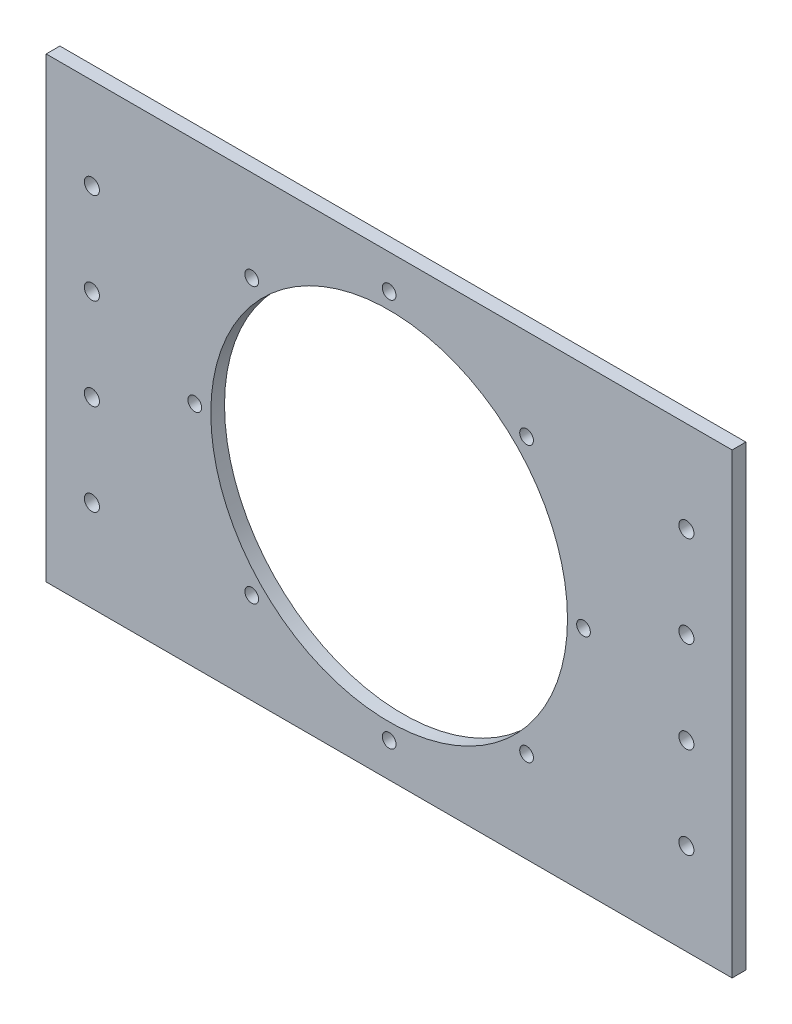
ISO-10303-21;
HEADER;
FILE_DESCRIPTION(('STEP AP214'),'2;1');
FILE_NAME('part.step','',(''),(''),'','','');
FILE_SCHEMA(('AUTOMOTIVE_DESIGN { 1 0 10303 214 1 1 1 1 }'));
ENDSEC;
DATA;
#1=APPLICATION_CONTEXT('core data for automotive mechanical design processes');
#2=APPLICATION_PROTOCOL_DEFINITION('international standard','automotive_design',2000,#1);
#3=PRODUCT_CONTEXT('',#1,'mechanical');
#4=PRODUCT('Part','Part','',(#3));
#5=PRODUCT_RELATED_PRODUCT_CATEGORY('part','',(#4));
#6=PRODUCT_DEFINITION_FORMATION('','',#4);
#7=PRODUCT_DEFINITION_CONTEXT('part definition',#1,'design');
#8=PRODUCT_DEFINITION('design','',#6,#7);
#9=PRODUCT_DEFINITION_SHAPE('','',#8);
#10=(LENGTH_UNIT() NAMED_UNIT(*) SI_UNIT(.MILLI.,.METRE.));
#11=(NAMED_UNIT(*) PLANE_ANGLE_UNIT() SI_UNIT($,.RADIAN.));
#12=(NAMED_UNIT(*) SI_UNIT($,.STERADIAN.) SOLID_ANGLE_UNIT());
#13=UNCERTAINTY_MEASURE_WITH_UNIT(LENGTH_MEASURE(1.E-05),#10,'distance_accuracy_value','');
#14=(GEOMETRIC_REPRESENTATION_CONTEXT(3) GLOBAL_UNCERTAINTY_ASSIGNED_CONTEXT((#13)) GLOBAL_UNIT_ASSIGNED_CONTEXT((#10,
#11,#12)) REPRESENTATION_CONTEXT('',''));
#15=CARTESIAN_POINT('',(0.,0.,0.));
#16=DIRECTION('',(0.,0.,1.));
#17=DIRECTION('',(1.,0.,0.));
#18=AXIS2_PLACEMENT_3D('',#15,#16,#17);
#19=CARTESIAN_POINT('',(0.,0.,3.));
#20=DIRECTION('',(0.,0.,1.));
#21=DIRECTION('',(1.,0.,0.));
#22=AXIS2_PLACEMENT_3D('',#19,#20,#21);
#23=PLANE('',#22);
#24=CARTESIAN_POINT('',(65.0000000000001,9.99999999999936,3.));
#25=DIRECTION('',(0.,0.,1.));
#26=DIRECTION('',(-1.,0.,0.));
#27=AXIS2_PLACEMENT_3D('',#24,#25,#26);
#28=CIRCLE('',#27,1.65000000000001);
#29=CARTESIAN_POINT('',(63.3500000000001,9.99999999999936,3.));
#30=VERTEX_POINT('',#29);
#31=EDGE_CURVE('E207',#30,#30,#28,.T.);
#32=ORIENTED_EDGE('',*,*,#31,.F.);
#33=EDGE_LOOP('',(#32));
#34=FACE_BOUND('',#33,.T.);
#35=CARTESIAN_POINT('',(64.9999999999997,-30.0000000000006,3.));
#36=DIRECTION('',(0.,0.,1.));
#37=DIRECTION('',(-1.,0.,0.));
#38=AXIS2_PLACEMENT_3D('',#35,#36,#37);
#39=CIRCLE('',#38,1.65000000000001);
#40=CARTESIAN_POINT('',(63.3499999999997,-30.0000000000006,3.));
#41=VERTEX_POINT('',#40);
#42=EDGE_CURVE('E195',#41,#41,#39,.T.);
#43=ORIENTED_EDGE('',*,*,#42,.F.);
#44=EDGE_LOOP('',(#43));
#45=FACE_BOUND('',#44,.T.);
#46=CARTESIAN_POINT('',(-65.,-10.,3.));
#47=DIRECTION('',(0.,0.,1.));
#48=DIRECTION('',(1.,0.,0.));
#49=AXIS2_PLACEMENT_3D('',#46,#47,#48);
#50=CIRCLE('',#49,1.65);
#51=CARTESIAN_POINT('',(-63.35,-10.,3.));
#52=VERTEX_POINT('',#51);
#53=EDGE_CURVE('E183',#52,#52,#50,.T.);
#54=ORIENTED_EDGE('',*,*,#53,.F.);
#55=EDGE_LOOP('',(#54));
#56=FACE_BOUND('',#55,.T.);
#57=CARTESIAN_POINT('',(-65.,30.,3.));
#58=DIRECTION('',(0.,0.,1.));
#59=DIRECTION('',(1.,0.,0.));
#60=AXIS2_PLACEMENT_3D('',#57,#58,#59);
#61=CIRCLE('',#60,1.65);
#62=CARTESIAN_POINT('',(-63.35,30.,3.));
#63=VERTEX_POINT('',#62);
#64=EDGE_CURVE('E171',#63,#63,#61,.T.);
#65=ORIENTED_EDGE('',*,*,#64,.F.);
#66=EDGE_LOOP('',(#65));
#67=FACE_BOUND('',#66,.T.);
#68=CARTESIAN_POINT('',(4.451638707025E-13,42.5,3.));
#69=DIRECTION('',(0.,0.,1.));
#70=DIRECTION('',(1.,0.,0.));
#71=AXIS2_PLACEMENT_3D('',#68,#69,#70);
#72=CIRCLE('',#71,1.50000000000001);
#73=CARTESIAN_POINT('',(1.50000000000045,42.5,3.));
#74=VERTEX_POINT('',#73);
#75=EDGE_CURVE('E159',#74,#74,#72,.T.);
#76=ORIENTED_EDGE('',*,*,#75,.F.);
#77=EDGE_LOOP('',(#76));
#78=FACE_BOUND('',#77,.T.);
#79=CARTESIAN_POINT('',(-42.5,2.96775913801666E-13,3.));
#80=DIRECTION('',(0.,0.,1.));
#81=DIRECTION('',(1.,0.,0.));
#82=AXIS2_PLACEMENT_3D('',#79,#80,#81);
#83=CIRCLE('',#82,1.5);
#84=CARTESIAN_POINT('',(-41.,2.96775913801666E-13,3.));
#85=VERTEX_POINT('',#84);
#86=EDGE_CURVE('E147',#85,#85,#83,.T.);
#87=ORIENTED_EDGE('',*,*,#86,.F.);
#88=EDGE_LOOP('',(#87));
#89=FACE_BOUND('',#88,.T.);
#90=CARTESIAN_POINT('',(-1.48387956900833E-13,-42.5,3.));
#91=DIRECTION('',(0.,0.,1.));
#92=DIRECTION('',(1.,0.,0.));
#93=AXIS2_PLACEMENT_3D('',#90,#91,#92);
#94=CIRCLE('',#93,1.5);
#95=CARTESIAN_POINT('',(1.49999999999985,-42.5,3.));
#96=VERTEX_POINT('',#95);
#97=EDGE_CURVE('E135',#96,#96,#94,.T.);
#98=ORIENTED_EDGE('',*,*,#97,.F.);
#99=EDGE_LOOP('',(#98));
#100=FACE_BOUND('',#99,.T.);
#101=CARTESIAN_POINT('',(42.5,0.,3.));
#102=DIRECTION('',(0.,0.,1.));
#103=DIRECTION('',(1.,0.,0.));
#104=AXIS2_PLACEMENT_3D('',#101,#102,#103);
#105=CIRCLE('',#104,1.5);
#106=CARTESIAN_POINT('',(44.,0.,3.));
#107=VERTEX_POINT('',#106);
#108=EDGE_CURVE('E123',#107,#107,#105,.T.);
#109=ORIENTED_EDGE('',*,*,#108,.F.);
#110=EDGE_LOOP('',(#109));
#111=FACE_BOUND('',#110,.T.);
#112=DIRECTION('',(0.,1.,0.));
#113=VECTOR('',#112,1.);
#114=CARTESIAN_POINT('',(75.,50.,3.));
#115=LINE('',#114,#113);
#116=CARTESIAN_POINT('',(75.,-50.,3.));
#117=VERTEX_POINT('',#116);
#118=CARTESIAN_POINT('',(75.,50.,3.));
#119=VERTEX_POINT('',#118);
#120=EDGE_CURVE('E93',#117,#119,#115,.T.);
#121=ORIENTED_EDGE('',*,*,#120,.T.);
#122=DIRECTION('',(-1.,0.,0.));
#123=VECTOR('',#122,1.);
#124=CARTESIAN_POINT('',(-75.,50.,3.));
#125=LINE('',#124,#123);
#126=CARTESIAN_POINT('',(-75.,50.,3.));
#127=VERTEX_POINT('',#126);
#128=EDGE_CURVE('E88',#119,#127,#125,.T.);
#129=ORIENTED_EDGE('',*,*,#128,.T.);
#130=DIRECTION('',(0.,-1.,0.));
#131=VECTOR('',#130,1.);
#132=CARTESIAN_POINT('',(-75.,50.,3.));
#133=LINE('',#132,#131);
#134=CARTESIAN_POINT('',(-75.,-50.,3.));
#135=VERTEX_POINT('',#134);
#136=EDGE_CURVE('E91',#127,#135,#133,.T.);
#137=ORIENTED_EDGE('',*,*,#136,.T.);
#138=DIRECTION('',(1.,0.,0.));
#139=VECTOR('',#138,1.);
#140=CARTESIAN_POINT('',(-75.,-50.,3.));
#141=LINE('',#140,#139);
#142=EDGE_CURVE('E58',#135,#117,#141,.T.);
#143=ORIENTED_EDGE('',*,*,#142,.T.);
#144=EDGE_LOOP('',(#121,#129,#137,#143));
#145=FACE_BOUND('',#144,.T.);
#146=CARTESIAN_POINT('',(0.,0.,3.));
#147=DIRECTION('',(0.,0.,1.));
#148=DIRECTION('',(1.,0.,0.));
#149=AXIS2_PLACEMENT_3D('',#146,#147,#148);
#150=CIRCLE('',#149,39.);
#151=CARTESIAN_POINT('',(39.,0.,3.));
#152=VERTEX_POINT('',#151);
#153=EDGE_CURVE('E108',#152,#152,#150,.T.);
#154=ORIENTED_EDGE('',*,*,#153,.F.);
#155=EDGE_LOOP('',(#154));
#156=FACE_BOUND('',#155,.T.);
#157=CARTESIAN_POINT('',(30.0520382004282,-30.0520382004283,3.));
#158=DIRECTION('',(0.,0.,1.));
#159=DIRECTION('',(1.,0.,0.));
#160=AXIS2_PLACEMENT_3D('',#157,#158,#159);
#161=CIRCLE('',#160,1.5);
#162=CARTESIAN_POINT('',(31.5520382004282,-30.0520382004283,3.));
#163=VERTEX_POINT('',#162);
#164=EDGE_CURVE('E129',#163,#163,#161,.T.);
#165=ORIENTED_EDGE('',*,*,#164,.F.);
#166=EDGE_LOOP('',(#165));
#167=FACE_BOUND('',#166,.T.);
#168=CARTESIAN_POINT('',(-30.0520382004284,-30.0520382004281,3.));
#169=DIRECTION('',(0.,0.,1.));
#170=DIRECTION('',(1.,0.,0.));
#171=AXIS2_PLACEMENT_3D('',#168,#169,#170);
#172=CIRCLE('',#171,1.5);
#173=CARTESIAN_POINT('',(-28.5520382004284,-30.0520382004281,3.));
#174=VERTEX_POINT('',#173);
#175=EDGE_CURVE('E141',#174,#174,#172,.T.);
#176=ORIENTED_EDGE('',*,*,#175,.F.);
#177=EDGE_LOOP('',(#176));
#178=FACE_BOUND('',#177,.T.);
#179=CARTESIAN_POINT('',(-30.052038200428,30.0520382004285,3.));
#180=DIRECTION('',(0.,0.,1.));
#181=DIRECTION('',(1.,0.,0.));
#182=AXIS2_PLACEMENT_3D('',#179,#180,#181);
#183=CIRCLE('',#182,1.50000000000001);
#184=CARTESIAN_POINT('',(-28.552038200428,30.0520382004285,3.));
#185=VERTEX_POINT('',#184);
#186=EDGE_CURVE('E153',#185,#185,#183,.T.);
#187=ORIENTED_EDGE('',*,*,#186,.F.);
#188=EDGE_LOOP('',(#187));
#189=FACE_BOUND('',#188,.T.);
#190=CARTESIAN_POINT('',(30.0520382004286,30.0520382004279,3.));
#191=DIRECTION('',(0.,0.,1.));
#192=DIRECTION('',(1.,0.,0.));
#193=AXIS2_PLACEMENT_3D('',#190,#191,#192);
#194=CIRCLE('',#193,1.50000000000001);
#195=CARTESIAN_POINT('',(31.5520382004287,30.0520382004279,3.));
#196=VERTEX_POINT('',#195);
#197=EDGE_CURVE('E165',#196,#196,#194,.T.);
#198=ORIENTED_EDGE('',*,*,#197,.F.);
#199=EDGE_LOOP('',(#198));
#200=FACE_BOUND('',#199,.T.);
#201=CARTESIAN_POINT('',(-65.,10.,3.));
#202=DIRECTION('',(0.,0.,1.));
#203=DIRECTION('',(1.,0.,0.));
#204=AXIS2_PLACEMENT_3D('',#201,#202,#203);
#205=CIRCLE('',#204,1.65);
#206=CARTESIAN_POINT('',(-63.35,10.,3.));
#207=VERTEX_POINT('',#206);
#208=EDGE_CURVE('E177',#207,#207,#205,.T.);
#209=ORIENTED_EDGE('',*,*,#208,.F.);
#210=EDGE_LOOP('',(#209));
#211=FACE_BOUND('',#210,.T.);
#212=CARTESIAN_POINT('',(-65.,-30.,3.));
#213=DIRECTION('',(0.,0.,1.));
#214=DIRECTION('',(1.,0.,0.));
#215=AXIS2_PLACEMENT_3D('',#212,#213,#214);
#216=CIRCLE('',#215,1.65);
#217=CARTESIAN_POINT('',(-63.35,-30.,3.));
#218=VERTEX_POINT('',#217);
#219=EDGE_CURVE('E189',#218,#218,#216,.T.);
#220=ORIENTED_EDGE('',*,*,#219,.F.);
#221=EDGE_LOOP('',(#220));
#222=FACE_BOUND('',#221,.T.);
#223=CARTESIAN_POINT('',(64.9999999999999,-10.0000000000006,3.));
#224=DIRECTION('',(0.,0.,1.));
#225=DIRECTION('',(-1.,0.,0.));
#226=AXIS2_PLACEMENT_3D('',#223,#224,#225);
#227=CIRCLE('',#226,1.64999999999998);
#228=CARTESIAN_POINT('',(63.3499999999999,-10.0000000000006,3.));
#229=VERTEX_POINT('',#228);
#230=EDGE_CURVE('E201',#229,#229,#227,.T.);
#231=ORIENTED_EDGE('',*,*,#230,.F.);
#232=EDGE_LOOP('',(#231));
#233=FACE_BOUND('',#232,.T.);
#234=CARTESIAN_POINT('',(65.0000000000003,29.9999999999994,3.));
#235=DIRECTION('',(0.,0.,1.));
#236=DIRECTION('',(-1.,0.,0.));
#237=AXIS2_PLACEMENT_3D('',#234,#235,#236);
#238=CIRCLE('',#237,1.65000000000001);
#239=CARTESIAN_POINT('',(63.3500000000003,29.9999999999994,3.));
#240=VERTEX_POINT('',#239);
#241=EDGE_CURVE('E213',#240,#240,#238,.T.);
#242=ORIENTED_EDGE('',*,*,#241,.F.);
#243=EDGE_LOOP('',(#242));
#244=FACE_BOUND('',#243,.T.);
#245=ADVANCED_FACE('F41',(#34,#45,#56,#67,#78,#89,#100,#111,#145,#156,#167,#178,#189,#200,#211,
#222,#233,#244),#23,.T.);
#246=CARTESIAN_POINT('',(0.,0.,0.));
#247=DIRECTION('',(0.,0.,1.));
#248=DIRECTION('',(1.,0.,0.));
#249=AXIS2_PLACEMENT_3D('',#246,#247,#248);
#250=PLANE('',#249);
#251=DIRECTION('',(0.,1.,0.));
#252=VECTOR('',#251,1.);
#253=CARTESIAN_POINT('',(75.,50.,0.));
#254=LINE('',#253,#252);
#255=CARTESIAN_POINT('',(75.,-50.,0.));
#256=VERTEX_POINT('',#255);
#257=CARTESIAN_POINT('',(75.,50.,0.));
#258=VERTEX_POINT('',#257);
#259=EDGE_CURVE('E105',#256,#258,#254,.T.);
#260=ORIENTED_EDGE('',*,*,#259,.F.);
#261=DIRECTION('',(1.,0.,0.));
#262=VECTOR('',#261,1.);
#263=CARTESIAN_POINT('',(-75.,-50.,0.));
#264=LINE('',#263,#262);
#265=CARTESIAN_POINT('',(-75.,-50.,0.));
#266=VERTEX_POINT('',#265);
#267=EDGE_CURVE('E81',#266,#256,#264,.T.);
#268=ORIENTED_EDGE('',*,*,#267,.F.);
#269=DIRECTION('',(0.,-1.,0.));
#270=VECTOR('',#269,1.);
#271=CARTESIAN_POINT('',(-75.,50.,0.));
#272=LINE('',#271,#270);
#273=CARTESIAN_POINT('',(-75.,50.,0.));
#274=VERTEX_POINT('',#273);
#275=EDGE_CURVE('E75',#274,#266,#272,.T.);
#276=ORIENTED_EDGE('',*,*,#275,.F.);
#277=DIRECTION('',(-1.,0.,0.));
#278=VECTOR('',#277,1.);
#279=CARTESIAN_POINT('',(-75.,50.,0.));
#280=LINE('',#279,#278);
#281=EDGE_CURVE('E97',#258,#274,#280,.T.);
#282=ORIENTED_EDGE('',*,*,#281,.F.);
#283=EDGE_LOOP('',(#260,#268,#276,#282));
#284=FACE_BOUND('',#283,.T.);
#285=CARTESIAN_POINT('',(0.,0.,0.));
#286=DIRECTION('',(0.,0.,1.));
#287=DIRECTION('',(1.,0.,0.));
#288=AXIS2_PLACEMENT_3D('',#285,#286,#287);
#289=CIRCLE('',#288,39.);
#290=CARTESIAN_POINT('',(39.,0.,0.));
#291=VERTEX_POINT('',#290);
#292=EDGE_CURVE('E120',#291,#291,#289,.T.);
#293=ORIENTED_EDGE('',*,*,#292,.T.);
#294=EDGE_LOOP('',(#293));
#295=FACE_BOUND('',#294,.T.);
#296=CARTESIAN_POINT('',(42.5,0.,0.));
#297=DIRECTION('',(0.,0.,1.));
#298=DIRECTION('',(1.,0.,0.));
#299=AXIS2_PLACEMENT_3D('',#296,#297,#298);
#300=CIRCLE('',#299,1.5);
#301=CARTESIAN_POINT('',(44.,0.,0.));
#302=VERTEX_POINT('',#301);
#303=EDGE_CURVE('E126',#302,#302,#300,.T.);
#304=ORIENTED_EDGE('',*,*,#303,.T.);
#305=EDGE_LOOP('',(#304));
#306=FACE_BOUND('',#305,.T.);
#307=CARTESIAN_POINT('',(30.0520382004282,-30.0520382004283,0.));
#308=DIRECTION('',(0.,0.,1.));
#309=DIRECTION('',(1.,0.,0.));
#310=AXIS2_PLACEMENT_3D('',#307,#308,#309);
#311=CIRCLE('',#310,1.5);
#312=CARTESIAN_POINT('',(31.5520382004282,-30.0520382004283,0.));
#313=VERTEX_POINT('',#312);
#314=EDGE_CURVE('E132',#313,#313,#311,.T.);
#315=ORIENTED_EDGE('',*,*,#314,.T.);
#316=EDGE_LOOP('',(#315));
#317=FACE_BOUND('',#316,.T.);
#318=CARTESIAN_POINT('',(-1.48387956900833E-13,-42.5,0.));
#319=DIRECTION('',(0.,0.,1.));
#320=DIRECTION('',(1.,0.,0.));
#321=AXIS2_PLACEMENT_3D('',#318,#319,#320);
#322=CIRCLE('',#321,1.5);
#323=CARTESIAN_POINT('',(1.49999999999985,-42.5,0.));
#324=VERTEX_POINT('',#323);
#325=EDGE_CURVE('E138',#324,#324,#322,.T.);
#326=ORIENTED_EDGE('',*,*,#325,.T.);
#327=EDGE_LOOP('',(#326));
#328=FACE_BOUND('',#327,.T.);
#329=CARTESIAN_POINT('',(-30.0520382004284,-30.0520382004281,0.));
#330=DIRECTION('',(0.,0.,1.));
#331=DIRECTION('',(1.,0.,0.));
#332=AXIS2_PLACEMENT_3D('',#329,#330,#331);
#333=CIRCLE('',#332,1.5);
#334=CARTESIAN_POINT('',(-28.5520382004284,-30.0520382004281,0.));
#335=VERTEX_POINT('',#334);
#336=EDGE_CURVE('E144',#335,#335,#333,.T.);
#337=ORIENTED_EDGE('',*,*,#336,.T.);
#338=EDGE_LOOP('',(#337));
#339=FACE_BOUND('',#338,.T.);
#340=CARTESIAN_POINT('',(-42.5,2.96775913801666E-13,0.));
#341=DIRECTION('',(0.,0.,1.));
#342=DIRECTION('',(1.,0.,0.));
#343=AXIS2_PLACEMENT_3D('',#340,#341,#342);
#344=CIRCLE('',#343,1.5);
#345=CARTESIAN_POINT('',(-41.,2.96775913801666E-13,0.));
#346=VERTEX_POINT('',#345);
#347=EDGE_CURVE('E150',#346,#346,#344,.T.);
#348=ORIENTED_EDGE('',*,*,#347,.T.);
#349=EDGE_LOOP('',(#348));
#350=FACE_BOUND('',#349,.T.);
#351=CARTESIAN_POINT('',(-30.052038200428,30.0520382004285,0.));
#352=DIRECTION('',(0.,0.,1.));
#353=DIRECTION('',(1.,0.,0.));
#354=AXIS2_PLACEMENT_3D('',#351,#352,#353);
#355=CIRCLE('',#354,1.50000000000001);
#356=CARTESIAN_POINT('',(-28.552038200428,30.0520382004285,0.));
#357=VERTEX_POINT('',#356);
#358=EDGE_CURVE('E156',#357,#357,#355,.T.);
#359=ORIENTED_EDGE('',*,*,#358,.T.);
#360=EDGE_LOOP('',(#359));
#361=FACE_BOUND('',#360,.T.);
#362=CARTESIAN_POINT('',(4.451638707025E-13,42.5,0.));
#363=DIRECTION('',(0.,0.,1.));
#364=DIRECTION('',(1.,0.,0.));
#365=AXIS2_PLACEMENT_3D('',#362,#363,#364);
#366=CIRCLE('',#365,1.50000000000001);
#367=CARTESIAN_POINT('',(1.50000000000045,42.5,0.));
#368=VERTEX_POINT('',#367);
#369=EDGE_CURVE('E162',#368,#368,#366,.T.);
#370=ORIENTED_EDGE('',*,*,#369,.T.);
#371=EDGE_LOOP('',(#370));
#372=FACE_BOUND('',#371,.T.);
#373=CARTESIAN_POINT('',(30.0520382004286,30.0520382004279,0.));
#374=DIRECTION('',(0.,0.,1.));
#375=DIRECTION('',(1.,0.,0.));
#376=AXIS2_PLACEMENT_3D('',#373,#374,#375);
#377=CIRCLE('',#376,1.50000000000001);
#378=CARTESIAN_POINT('',(31.5520382004287,30.0520382004279,0.));
#379=VERTEX_POINT('',#378);
#380=EDGE_CURVE('E168',#379,#379,#377,.T.);
#381=ORIENTED_EDGE('',*,*,#380,.T.);
#382=EDGE_LOOP('',(#381));
#383=FACE_BOUND('',#382,.T.);
#384=CARTESIAN_POINT('',(-65.,30.,0.));
#385=DIRECTION('',(0.,0.,1.));
#386=DIRECTION('',(1.,0.,0.));
#387=AXIS2_PLACEMENT_3D('',#384,#385,#386);
#388=CIRCLE('',#387,1.65);
#389=CARTESIAN_POINT('',(-63.35,30.,0.));
#390=VERTEX_POINT('',#389);
#391=EDGE_CURVE('E174',#390,#390,#388,.T.);
#392=ORIENTED_EDGE('',*,*,#391,.T.);
#393=EDGE_LOOP('',(#392));
#394=FACE_BOUND('',#393,.T.);
#395=CARTESIAN_POINT('',(-65.,10.,0.));
#396=DIRECTION('',(0.,0.,1.));
#397=DIRECTION('',(1.,0.,0.));
#398=AXIS2_PLACEMENT_3D('',#395,#396,#397);
#399=CIRCLE('',#398,1.65);
#400=CARTESIAN_POINT('',(-63.35,10.,0.));
#401=VERTEX_POINT('',#400);
#402=EDGE_CURVE('E180',#401,#401,#399,.T.);
#403=ORIENTED_EDGE('',*,*,#402,.T.);
#404=EDGE_LOOP('',(#403));
#405=FACE_BOUND('',#404,.T.);
#406=CARTESIAN_POINT('',(-65.,-10.,0.));
#407=DIRECTION('',(0.,0.,1.));
#408=DIRECTION('',(1.,0.,0.));
#409=AXIS2_PLACEMENT_3D('',#406,#407,#408);
#410=CIRCLE('',#409,1.65);
#411=CARTESIAN_POINT('',(-63.35,-10.,0.));
#412=VERTEX_POINT('',#411);
#413=EDGE_CURVE('E186',#412,#412,#410,.T.);
#414=ORIENTED_EDGE('',*,*,#413,.T.);
#415=EDGE_LOOP('',(#414));
#416=FACE_BOUND('',#415,.T.);
#417=CARTESIAN_POINT('',(-65.,-30.,0.));
#418=DIRECTION('',(0.,0.,1.));
#419=DIRECTION('',(1.,0.,0.));
#420=AXIS2_PLACEMENT_3D('',#417,#418,#419);
#421=CIRCLE('',#420,1.65);
#422=CARTESIAN_POINT('',(-63.35,-30.,0.));
#423=VERTEX_POINT('',#422);
#424=EDGE_CURVE('E192',#423,#423,#421,.T.);
#425=ORIENTED_EDGE('',*,*,#424,.T.);
#426=EDGE_LOOP('',(#425));
#427=FACE_BOUND('',#426,.T.);
#428=CARTESIAN_POINT('',(64.9999999999997,-30.0000000000006,0.));
#429=DIRECTION('',(0.,0.,1.));
#430=DIRECTION('',(-1.,0.,0.));
#431=AXIS2_PLACEMENT_3D('',#428,#429,#430);
#432=CIRCLE('',#431,1.65000000000001);
#433=CARTESIAN_POINT('',(63.3499999999997,-30.0000000000006,0.));
#434=VERTEX_POINT('',#433);
#435=EDGE_CURVE('E198',#434,#434,#432,.T.);
#436=ORIENTED_EDGE('',*,*,#435,.T.);
#437=EDGE_LOOP('',(#436));
#438=FACE_BOUND('',#437,.T.);
#439=CARTESIAN_POINT('',(64.9999999999999,-10.0000000000006,0.));
#440=DIRECTION('',(0.,0.,1.));
#441=DIRECTION('',(-1.,0.,0.));
#442=AXIS2_PLACEMENT_3D('',#439,#440,#441);
#443=CIRCLE('',#442,1.64999999999998);
#444=CARTESIAN_POINT('',(63.3499999999999,-10.0000000000006,0.));
#445=VERTEX_POINT('',#444);
#446=EDGE_CURVE('E204',#445,#445,#443,.T.);
#447=ORIENTED_EDGE('',*,*,#446,.T.);
#448=EDGE_LOOP('',(#447));
#449=FACE_BOUND('',#448,.T.);
#450=CARTESIAN_POINT('',(65.0000000000001,9.99999999999936,0.));
#451=DIRECTION('',(0.,0.,1.));
#452=DIRECTION('',(-1.,0.,0.));
#453=AXIS2_PLACEMENT_3D('',#450,#451,#452);
#454=CIRCLE('',#453,1.65000000000001);
#455=CARTESIAN_POINT('',(63.3500000000001,9.99999999999936,0.));
#456=VERTEX_POINT('',#455);
#457=EDGE_CURVE('E210',#456,#456,#454,.T.);
#458=ORIENTED_EDGE('',*,*,#457,.T.);
#459=EDGE_LOOP('',(#458));
#460=FACE_BOUND('',#459,.T.);
#461=CARTESIAN_POINT('',(65.0000000000003,29.9999999999994,0.));
#462=DIRECTION('',(0.,0.,1.));
#463=DIRECTION('',(-1.,0.,0.));
#464=AXIS2_PLACEMENT_3D('',#461,#462,#463);
#465=CIRCLE('',#464,1.65000000000001);
#466=CARTESIAN_POINT('',(63.3500000000003,29.9999999999994,0.));
#467=VERTEX_POINT('',#466);
#468=EDGE_CURVE('E216',#467,#467,#465,.T.);
#469=ORIENTED_EDGE('',*,*,#468,.T.);
#470=EDGE_LOOP('',(#469));
#471=FACE_BOUND('',#470,.T.);
#472=ADVANCED_FACE('F116',(#284,#295,#306,#317,#328,#339,#350,#361,#372,#383,#394,#405,#416,
#427,#438,#449,#460,#471),#250,.F.);
#473=CARTESIAN_POINT('',(75.,50.,3.));
#474=DIRECTION('',(-1.,0.,0.));
#475=DIRECTION('',(0.,0.,1.));
#476=AXIS2_PLACEMENT_3D('',#473,#474,#475);
#477=PLANE('',#476);
#478=ORIENTED_EDGE('',*,*,#259,.T.);
#479=DIRECTION('',(0.,0.,-1.));
#480=VECTOR('',#479,1.);
#481=CARTESIAN_POINT('',(75.,50.,3.));
#482=LINE('',#481,#480);
#483=EDGE_CURVE('E11',#119,#258,#482,.T.);
#484=ORIENTED_EDGE('',*,*,#483,.F.);
#485=ORIENTED_EDGE('',*,*,#120,.F.);
#486=DIRECTION('',(0.,0.,-1.));
#487=VECTOR('',#486,1.);
#488=CARTESIAN_POINT('',(75.,-50.,3.));
#489=LINE('',#488,#487);
#490=EDGE_CURVE('E101',#117,#256,#489,.T.);
#491=ORIENTED_EDGE('',*,*,#490,.T.);
#492=EDGE_LOOP('',(#478,#484,#485,#491));
#493=FACE_BOUND('',#492,.T.);
#494=ADVANCED_FACE('F43',(#493),#477,.F.);
#495=CARTESIAN_POINT('',(-75.,50.,3.));
#496=DIRECTION('',(0.,-1.,0.));
#497=DIRECTION('',(0.,0.,-1.));
#498=AXIS2_PLACEMENT_3D('',#495,#496,#497);
#499=PLANE('',#498);
#500=ORIENTED_EDGE('',*,*,#281,.T.);
#501=DIRECTION('',(0.,0.,-1.));
#502=VECTOR('',#501,1.);
#503=CARTESIAN_POINT('',(-75.,50.,3.));
#504=LINE('',#503,#502);
#505=EDGE_CURVE('E50',#127,#274,#504,.T.);
#506=ORIENTED_EDGE('',*,*,#505,.F.);
#507=ORIENTED_EDGE('',*,*,#128,.F.);
#508=ORIENTED_EDGE('',*,*,#483,.T.);
#509=EDGE_LOOP('',(#500,#506,#507,#508));
#510=FACE_BOUND('',#509,.T.);
#511=ADVANCED_FACE('F96',(#510),#499,.F.);
#512=CARTESIAN_POINT('',(-75.,50.,3.));
#513=DIRECTION('',(1.,0.,0.));
#514=DIRECTION('',(0.,1.,0.));
#515=AXIS2_PLACEMENT_3D('',#512,#513,#514);
#516=PLANE('',#515);
#517=ORIENTED_EDGE('',*,*,#275,.T.);
#518=DIRECTION('',(0.,0.,-1.));
#519=VECTOR('',#518,1.);
#520=CARTESIAN_POINT('',(-75.,-50.,3.));
#521=LINE('',#520,#519);
#522=EDGE_CURVE('E98',#135,#266,#521,.T.);
#523=ORIENTED_EDGE('',*,*,#522,.F.);
#524=ORIENTED_EDGE('',*,*,#136,.F.);
#525=ORIENTED_EDGE('',*,*,#505,.T.);
#526=EDGE_LOOP('',(#517,#523,#524,#525));
#527=FACE_BOUND('',#526,.T.);
#528=ADVANCED_FACE('F99',(#527),#516,.F.);
#529=CARTESIAN_POINT('',(-75.,-50.,3.));
#530=DIRECTION('',(0.,1.,0.));
#531=DIRECTION('',(0.,0.,1.));
#532=AXIS2_PLACEMENT_3D('',#529,#530,#531);
#533=PLANE('',#532);
#534=ORIENTED_EDGE('',*,*,#267,.T.);
#535=ORIENTED_EDGE('',*,*,#490,.F.);
#536=ORIENTED_EDGE('',*,*,#142,.F.);
#537=ORIENTED_EDGE('',*,*,#522,.T.);
#538=EDGE_LOOP('',(#534,#535,#536,#537));
#539=FACE_BOUND('',#538,.T.);
#540=ADVANCED_FACE('F113',(#539),#533,.F.);
#541=CARTESIAN_POINT('',(0.,0.,3.));
#542=DIRECTION('',(0.,0.,-1.));
#543=DIRECTION('',(-1.,0.,0.));
#544=AXIS2_PLACEMENT_3D('',#541,#542,#543);
#545=CYLINDRICAL_SURFACE('',#544,39.);
#546=ORIENTED_EDGE('',*,*,#153,.T.);
#547=EDGE_LOOP('',(#546));
#548=FACE_BOUND('',#547,.T.);
#549=ORIENTED_EDGE('',*,*,#292,.F.);
#550=EDGE_LOOP('',(#549));
#551=FACE_BOUND('',#550,.T.);
#552=ADVANCED_FACE('F235',(#548,#551),#545,.F.);
#553=CARTESIAN_POINT('',(42.5,0.,3.));
#554=DIRECTION('',(0.,0.,-1.));
#555=DIRECTION('',(-1.,0.,0.));
#556=AXIS2_PLACEMENT_3D('',#553,#554,#555);
#557=CYLINDRICAL_SURFACE('',#556,1.5);
#558=ORIENTED_EDGE('',*,*,#108,.T.);
#559=EDGE_LOOP('',(#558));
#560=FACE_BOUND('',#559,.T.);
#561=ORIENTED_EDGE('',*,*,#303,.F.);
#562=EDGE_LOOP('',(#561));
#563=FACE_BOUND('',#562,.T.);
#564=ADVANCED_FACE('F280',(#560,#563),#557,.F.);
#565=CARTESIAN_POINT('',(30.0520382004282,-30.0520382004283,3.));
#566=DIRECTION('',(0.,0.,-1.));
#567=DIRECTION('',(-1.,0.,0.));
#568=AXIS2_PLACEMENT_3D('',#565,#566,#567);
#569=CYLINDRICAL_SURFACE('',#568,1.5);
#570=ORIENTED_EDGE('',*,*,#164,.T.);
#571=EDGE_LOOP('',(#570));
#572=FACE_BOUND('',#571,.T.);
#573=ORIENTED_EDGE('',*,*,#314,.F.);
#574=EDGE_LOOP('',(#573));
#575=FACE_BOUND('',#574,.T.);
#576=ADVANCED_FACE('F288',(#572,#575),#569,.F.);
#577=CARTESIAN_POINT('',(-1.48387956900833E-13,-42.5,3.));
#578=DIRECTION('',(0.,0.,-1.));
#579=DIRECTION('',(-1.,0.,0.));
#580=AXIS2_PLACEMENT_3D('',#577,#578,#579);
#581=CYLINDRICAL_SURFACE('',#580,1.5);
#582=ORIENTED_EDGE('',*,*,#97,.T.);
#583=EDGE_LOOP('',(#582));
#584=FACE_BOUND('',#583,.T.);
#585=ORIENTED_EDGE('',*,*,#325,.F.);
#586=EDGE_LOOP('',(#585));
#587=FACE_BOUND('',#586,.T.);
#588=ADVANCED_FACE('F296',(#584,#587),#581,.F.);
#589=CARTESIAN_POINT('',(-30.0520382004284,-30.0520382004281,3.));
#590=DIRECTION('',(0.,0.,-1.));
#591=DIRECTION('',(-1.,0.,0.));
#592=AXIS2_PLACEMENT_3D('',#589,#590,#591);
#593=CYLINDRICAL_SURFACE('',#592,1.5);
#594=ORIENTED_EDGE('',*,*,#175,.T.);
#595=EDGE_LOOP('',(#594));
#596=FACE_BOUND('',#595,.T.);
#597=ORIENTED_EDGE('',*,*,#336,.F.);
#598=EDGE_LOOP('',(#597));
#599=FACE_BOUND('',#598,.T.);
#600=ADVANCED_FACE('F305',(#596,#599),#593,.F.);
#601=CARTESIAN_POINT('',(-42.5,2.96775913801666E-13,3.));
#602=DIRECTION('',(0.,0.,-1.));
#603=DIRECTION('',(-1.,0.,0.));
#604=AXIS2_PLACEMENT_3D('',#601,#602,#603);
#605=CYLINDRICAL_SURFACE('',#604,1.5);
#606=ORIENTED_EDGE('',*,*,#86,.T.);
#607=EDGE_LOOP('',(#606));
#608=FACE_BOUND('',#607,.T.);
#609=ORIENTED_EDGE('',*,*,#347,.F.);
#610=EDGE_LOOP('',(#609));
#611=FACE_BOUND('',#610,.T.);
#612=ADVANCED_FACE('F314',(#608,#611),#605,.F.);
#613=CARTESIAN_POINT('',(-30.052038200428,30.0520382004285,3.));
#614=DIRECTION('',(0.,0.,-1.));
#615=DIRECTION('',(-1.,0.,0.));
#616=AXIS2_PLACEMENT_3D('',#613,#614,#615);
#617=CYLINDRICAL_SURFACE('',#616,1.50000000000001);
#618=ORIENTED_EDGE('',*,*,#186,.T.);
#619=EDGE_LOOP('',(#618));
#620=FACE_BOUND('',#619,.T.);
#621=ORIENTED_EDGE('',*,*,#358,.F.);
#622=EDGE_LOOP('',(#621));
#623=FACE_BOUND('',#622,.T.);
#624=ADVANCED_FACE('F323',(#620,#623),#617,.F.);
#625=CARTESIAN_POINT('',(4.451638707025E-13,42.5,3.));
#626=DIRECTION('',(0.,0.,-1.));
#627=DIRECTION('',(-1.,0.,0.));
#628=AXIS2_PLACEMENT_3D('',#625,#626,#627);
#629=CYLINDRICAL_SURFACE('',#628,1.50000000000001);
#630=ORIENTED_EDGE('',*,*,#75,.T.);
#631=EDGE_LOOP('',(#630));
#632=FACE_BOUND('',#631,.T.);
#633=ORIENTED_EDGE('',*,*,#369,.F.);
#634=EDGE_LOOP('',(#633));
#635=FACE_BOUND('',#634,.T.);
#636=ADVANCED_FACE('F332',(#632,#635),#629,.F.);
#637=CARTESIAN_POINT('',(30.0520382004286,30.0520382004279,3.));
#638=DIRECTION('',(0.,0.,-1.));
#639=DIRECTION('',(-1.,0.,0.));
#640=AXIS2_PLACEMENT_3D('',#637,#638,#639);
#641=CYLINDRICAL_SURFACE('',#640,1.50000000000001);
#642=ORIENTED_EDGE('',*,*,#197,.T.);
#643=EDGE_LOOP('',(#642));
#644=FACE_BOUND('',#643,.T.);
#645=ORIENTED_EDGE('',*,*,#380,.F.);
#646=EDGE_LOOP('',(#645));
#647=FACE_BOUND('',#646,.T.);
#648=ADVANCED_FACE('F341',(#644,#647),#641,.F.);
#649=CARTESIAN_POINT('',(-65.,30.,3.));
#650=DIRECTION('',(0.,0.,-1.));
#651=DIRECTION('',(-1.,0.,0.));
#652=AXIS2_PLACEMENT_3D('',#649,#650,#651);
#653=CYLINDRICAL_SURFACE('',#652,1.65);
#654=ORIENTED_EDGE('',*,*,#64,.T.);
#655=EDGE_LOOP('',(#654));
#656=FACE_BOUND('',#655,.T.);
#657=ORIENTED_EDGE('',*,*,#391,.F.);
#658=EDGE_LOOP('',(#657));
#659=FACE_BOUND('',#658,.T.);
#660=ADVANCED_FACE('F350',(#656,#659),#653,.F.);
#661=CARTESIAN_POINT('',(-65.,10.,3.));
#662=DIRECTION('',(0.,0.,-1.));
#663=DIRECTION('',(-1.,0.,0.));
#664=AXIS2_PLACEMENT_3D('',#661,#662,#663);
#665=CYLINDRICAL_SURFACE('',#664,1.65);
#666=ORIENTED_EDGE('',*,*,#208,.T.);
#667=EDGE_LOOP('',(#666));
#668=FACE_BOUND('',#667,.T.);
#669=ORIENTED_EDGE('',*,*,#402,.F.);
#670=EDGE_LOOP('',(#669));
#671=FACE_BOUND('',#670,.T.);
#672=ADVANCED_FACE('F359',(#668,#671),#665,.F.);
#673=CARTESIAN_POINT('',(-65.,-10.,3.));
#674=DIRECTION('',(0.,0.,-1.));
#675=DIRECTION('',(-1.,0.,0.));
#676=AXIS2_PLACEMENT_3D('',#673,#674,#675);
#677=CYLINDRICAL_SURFACE('',#676,1.65);
#678=ORIENTED_EDGE('',*,*,#53,.T.);
#679=EDGE_LOOP('',(#678));
#680=FACE_BOUND('',#679,.T.);
#681=ORIENTED_EDGE('',*,*,#413,.F.);
#682=EDGE_LOOP('',(#681));
#683=FACE_BOUND('',#682,.T.);
#684=ADVANCED_FACE('F368',(#680,#683),#677,.F.);
#685=CARTESIAN_POINT('',(-65.,-30.,3.));
#686=DIRECTION('',(0.,0.,-1.));
#687=DIRECTION('',(-1.,0.,0.));
#688=AXIS2_PLACEMENT_3D('',#685,#686,#687);
#689=CYLINDRICAL_SURFACE('',#688,1.65);
#690=ORIENTED_EDGE('',*,*,#219,.T.);
#691=EDGE_LOOP('',(#690));
#692=FACE_BOUND('',#691,.T.);
#693=ORIENTED_EDGE('',*,*,#424,.F.);
#694=EDGE_LOOP('',(#693));
#695=FACE_BOUND('',#694,.T.);
#696=ADVANCED_FACE('F377',(#692,#695),#689,.F.);
#697=CARTESIAN_POINT('',(64.9999999999997,-30.0000000000006,3.));
#698=DIRECTION('',(0.,0.,-1.));
#699=DIRECTION('',(-1.,0.,0.));
#700=AXIS2_PLACEMENT_3D('',#697,#698,#699);
#701=CYLINDRICAL_SURFACE('',#700,1.65000000000001);
#702=ORIENTED_EDGE('',*,*,#42,.T.);
#703=EDGE_LOOP('',(#702));
#704=FACE_BOUND('',#703,.T.);
#705=ORIENTED_EDGE('',*,*,#435,.F.);
#706=EDGE_LOOP('',(#705));
#707=FACE_BOUND('',#706,.T.);
#708=ADVANCED_FACE('F386',(#704,#707),#701,.F.);
#709=CARTESIAN_POINT('',(64.9999999999999,-10.0000000000006,3.));
#710=DIRECTION('',(0.,0.,-1.));
#711=DIRECTION('',(-1.,0.,0.));
#712=AXIS2_PLACEMENT_3D('',#709,#710,#711);
#713=CYLINDRICAL_SURFACE('',#712,1.64999999999998);
#714=ORIENTED_EDGE('',*,*,#230,.T.);
#715=EDGE_LOOP('',(#714));
#716=FACE_BOUND('',#715,.T.);
#717=ORIENTED_EDGE('',*,*,#446,.F.);
#718=EDGE_LOOP('',(#717));
#719=FACE_BOUND('',#718,.T.);
#720=ADVANCED_FACE('F395',(#716,#719),#713,.F.);
#721=CARTESIAN_POINT('',(65.0000000000001,9.99999999999936,3.));
#722=DIRECTION('',(0.,0.,-1.));
#723=DIRECTION('',(-1.,0.,0.));
#724=AXIS2_PLACEMENT_3D('',#721,#722,#723);
#725=CYLINDRICAL_SURFACE('',#724,1.65000000000001);
#726=ORIENTED_EDGE('',*,*,#31,.T.);
#727=EDGE_LOOP('',(#726));
#728=FACE_BOUND('',#727,.T.);
#729=ORIENTED_EDGE('',*,*,#457,.F.);
#730=EDGE_LOOP('',(#729));
#731=FACE_BOUND('',#730,.T.);
#732=ADVANCED_FACE('F404',(#728,#731),#725,.F.);
#733=CARTESIAN_POINT('',(65.0000000000003,29.9999999999994,3.));
#734=DIRECTION('',(0.,0.,-1.));
#735=DIRECTION('',(-1.,0.,0.));
#736=AXIS2_PLACEMENT_3D('',#733,#734,#735);
#737=CYLINDRICAL_SURFACE('',#736,1.65000000000001);
#738=ORIENTED_EDGE('',*,*,#241,.T.);
#739=EDGE_LOOP('',(#738));
#740=FACE_BOUND('',#739,.T.);
#741=ORIENTED_EDGE('',*,*,#468,.F.);
#742=EDGE_LOOP('',(#741));
#743=FACE_BOUND('',#742,.T.);
#744=ADVANCED_FACE('F222',(#740,#743),#737,.F.);
#745=CLOSED_SHELL('',(#245,#472,#494,#511,#528,#540,#552,#564,#576,#588,#600,#612,#624,#636,
#648,#660,#672,#684,#696,#708,#720,#732,#744));
#746=MANIFOLD_SOLID_BREP('B2',#745);
#747=ADVANCED_BREP_SHAPE_REPRESENTATION('',(#18,#746),#14);
#748=SHAPE_DEFINITION_REPRESENTATION(#9,#747);
ENDSEC;
END-ISO-10303-21;
